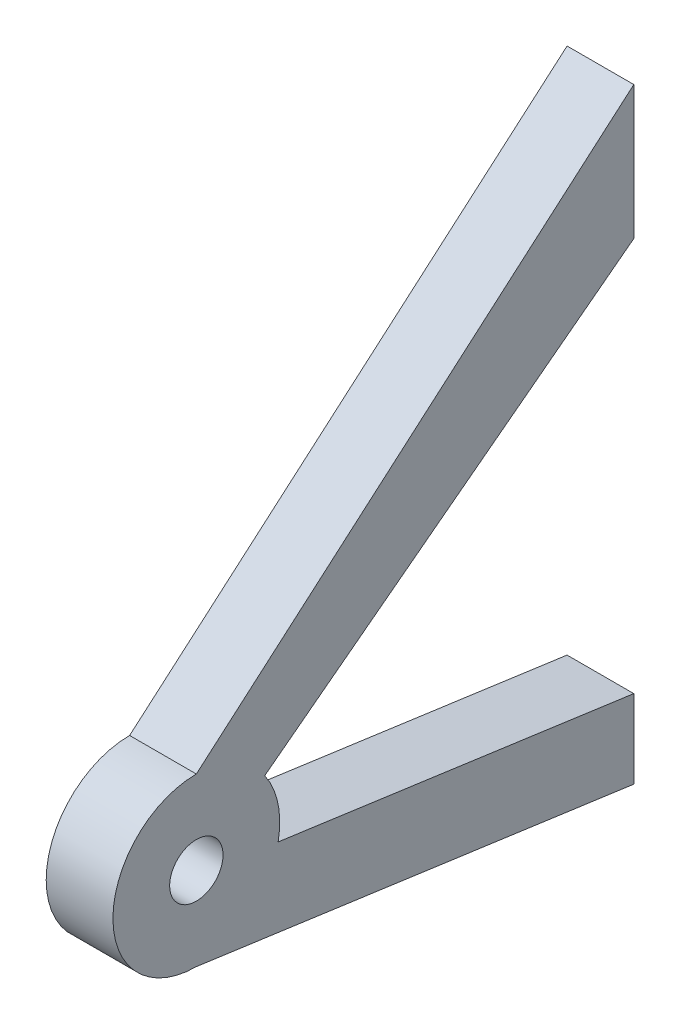
ISO-10303-21;
HEADER;
FILE_DESCRIPTION(('STEP AP214'),'2;1');
FILE_NAME('part.step','',(''),(''),'','','');
FILE_SCHEMA(('AUTOMOTIVE_DESIGN { 1 0 10303 214 1 1 1 1 }'));
ENDSEC;
DATA;
#1=APPLICATION_CONTEXT('core data for automotive mechanical design processes');
#2=APPLICATION_PROTOCOL_DEFINITION('international standard','automotive_design',2000,#1);
#3=PRODUCT_CONTEXT('',#1,'mechanical');
#4=PRODUCT('Part','Part','',(#3));
#5=PRODUCT_RELATED_PRODUCT_CATEGORY('part','',(#4));
#6=PRODUCT_DEFINITION_FORMATION('','',#4);
#7=PRODUCT_DEFINITION_CONTEXT('part definition',#1,'design');
#8=PRODUCT_DEFINITION('design','',#6,#7);
#9=PRODUCT_DEFINITION_SHAPE('','',#8);
#10=(LENGTH_UNIT() NAMED_UNIT(*) SI_UNIT(.MILLI.,.METRE.));
#11=(NAMED_UNIT(*) PLANE_ANGLE_UNIT() SI_UNIT($,.RADIAN.));
#12=(NAMED_UNIT(*) SI_UNIT($,.STERADIAN.) SOLID_ANGLE_UNIT());
#13=UNCERTAINTY_MEASURE_WITH_UNIT(LENGTH_MEASURE(1.E-05),#10,'distance_accuracy_value','');
#14=(GEOMETRIC_REPRESENTATION_CONTEXT(3) GLOBAL_UNCERTAINTY_ASSIGNED_CONTEXT((#13)) GLOBAL_UNIT_ASSIGNED_CONTEXT((#10,
#11,#12)) REPRESENTATION_CONTEXT('',''));
#15=CARTESIAN_POINT('',(0.,0.,0.));
#16=DIRECTION('',(0.,0.,1.));
#17=DIRECTION('',(1.,0.,0.));
#18=AXIS2_PLACEMENT_3D('',#15,#16,#17);
#19=CARTESIAN_POINT('',(-27.9271684967378,17.419112642267,164.013892996037));
#20=DIRECTION('',(1.,0.,0.));
#21=DIRECTION('',(0.,1.,0.));
#22=AXIS2_PLACEMENT_3D('',#19,#20,#21);
#23=CYLINDRICAL_SURFACE('',#22,7.93750000000001);
#24=CARTESIAN_POINT('',(-21.5771684967378,17.419112642267,164.013892996037));
#25=DIRECTION('',(1.,0.,0.));
#26=DIRECTION('',(0.,1.,0.));
#27=AXIS2_PLACEMENT_3D('',#24,#25,#26);
#28=CIRCLE('',#27,7.93750000000001);
#29=CARTESIAN_POINT('',(-21.5771684967378,21.9653877787596,157.507335639545));
#30=VERTEX_POINT('',#29);
#31=CARTESIAN_POINT('',(-21.5771684967378,15.8677740511462,156.22946913645));
#32=VERTEX_POINT('',#31);
#33=EDGE_CURVE('E137',#30,#32,#28,.F.);
#34=ORIENTED_EDGE('',*,*,#33,.T.);
#35=DIRECTION('',(1.,0.,0.));
#36=VECTOR('',#35,1.);
#37=CARTESIAN_POINT('',(-27.9271684967378,15.8677740511462,156.22946913645));
#38=LINE('',#37,#36);
#39=CARTESIAN_POINT('',(-27.9271684967378,15.8677740511462,156.22946913645));
#40=VERTEX_POINT('',#39);
#41=EDGE_CURVE('E11',#40,#32,#38,.T.);
#42=ORIENTED_EDGE('',*,*,#41,.F.);
#43=CARTESIAN_POINT('',(-27.9271684967378,17.419112642267,164.013892996037));
#44=DIRECTION('',(1.,0.,0.));
#45=DIRECTION('',(0.,1.,0.));
#46=AXIS2_PLACEMENT_3D('',#43,#44,#45);
#47=CIRCLE('',#46,7.93750000000001);
#48=CARTESIAN_POINT('',(-27.9271684967378,21.9653877787596,157.507335639545));
#49=VERTEX_POINT('',#48);
#50=EDGE_CURVE('E154',#49,#40,#47,.F.);
#51=ORIENTED_EDGE('',*,*,#50,.F.);
#52=DIRECTION('',(1.,0.,0.));
#53=VECTOR('',#52,1.);
#54=CARTESIAN_POINT('',(-27.9271684967378,21.9653877787596,157.507335639545));
#55=LINE('',#54,#53);
#56=EDGE_CURVE('E39',#49,#30,#55,.T.);
#57=ORIENTED_EDGE('',*,*,#56,.T.);
#58=EDGE_LOOP('',(#34,#42,#51,#57));
#59=FACE_BOUND('',#58,.T.);
#60=ADVANCED_FACE('F36',(#59),#23,.T.);
#61=CARTESIAN_POINT('',(-27.9271684967378,-5.70980536664582,0.792629204329803));
#62=DIRECTION('',(0.,-0.990501709789782,0.137500410557634));
#63=DIRECTION('',(0.,-0.137500410557634,-0.990501709789782));
#64=AXIS2_PLACEMENT_3D('',#61,#62,#63);
#65=PLANE('',#64);
#66=DIRECTION('',(0.,-0.137500410557634,-0.990501709789782));
#67=VECTOR('',#66,1.);
#68=CARTESIAN_POINT('',(-21.5771684967378,-5.70980536664582,0.792629204329803));
#69=LINE('',#68,#67);
#70=CARTESIAN_POINT('',(-21.5771684967378,11.169831477006,122.387241805575));
#71=VERTEX_POINT('',#70);
#72=EDGE_CURVE('E79',#32,#71,#69,.T.);
#73=ORIENTED_EDGE('',*,*,#72,.T.);
#74=DIRECTION('',(1.,0.,0.));
#75=VECTOR('',#74,1.);
#76=CARTESIAN_POINT('',(-27.9271684967378,11.169831477006,122.387241805575));
#77=LINE('',#76,#75);
#78=CARTESIAN_POINT('',(-27.9271684967378,11.169831477006,122.387241805575));
#79=VERTEX_POINT('',#78);
#80=EDGE_CURVE('E45',#79,#71,#77,.T.);
#81=ORIENTED_EDGE('',*,*,#80,.F.);
#82=DIRECTION('',(0.,-0.137500410557634,-0.990501709789782));
#83=VECTOR('',#82,1.);
#84=CARTESIAN_POINT('',(-27.9271684967378,-5.70980536664582,0.792629204329803));
#85=LINE('',#84,#83);
#86=EDGE_CURVE('E53',#40,#79,#85,.T.);
#87=ORIENTED_EDGE('',*,*,#86,.F.);
#88=ORIENTED_EDGE('',*,*,#41,.T.);
#89=EDGE_LOOP('',(#73,#81,#87,#88));
#90=FACE_BOUND('',#89,.T.);
#91=ADVANCED_FACE('F190',(#90),#65,.F.);
#92=CARTESIAN_POINT('',(-27.9271684967378,0.,122.387241805575));
#93=DIRECTION('',(0.,0.,1.));
#94=DIRECTION('',(1.,0.,0.));
#95=AXIS2_PLACEMENT_3D('',#92,#93,#94);
#96=PLANE('',#95);
#97=DIRECTION('',(0.,-1.,0.));
#98=VECTOR('',#97,1.);
#99=CARTESIAN_POINT('',(-21.5771684967378,0.,122.387241805575));
#100=LINE('',#99,#98);
#101=CARTESIAN_POINT('',(-21.5771684967378,3.70304449618815,122.387241805575));
#102=VERTEX_POINT('',#101);
#103=EDGE_CURVE('E119',#71,#102,#100,.T.);
#104=ORIENTED_EDGE('',*,*,#103,.T.);
#105=DIRECTION('',(1.,0.,0.));
#106=VECTOR('',#105,1.);
#107=CARTESIAN_POINT('',(-27.9271684967378,3.70304449618815,122.387241805575));
#108=LINE('',#107,#106);
#109=CARTESIAN_POINT('',(-27.9271684967378,3.70304449618815,122.387241805575));
#110=VERTEX_POINT('',#109);
#111=EDGE_CURVE('E117',#110,#102,#108,.T.);
#112=ORIENTED_EDGE('',*,*,#111,.F.);
#113=DIRECTION('',(0.,-1.,0.));
#114=VECTOR('',#113,1.);
#115=CARTESIAN_POINT('',(-27.9271684967378,0.,122.387241805575));
#116=LINE('',#115,#114);
#117=EDGE_CURVE('E105',#79,#110,#116,.T.);
#118=ORIENTED_EDGE('',*,*,#117,.F.);
#119=ORIENTED_EDGE('',*,*,#80,.T.);
#120=EDGE_LOOP('',(#104,#112,#118,#119));
#121=FACE_BOUND('',#120,.T.);
#122=ADVANCED_FACE('F118',(#121),#96,.F.);
#123=CARTESIAN_POINT('',(-27.9271684967378,-13.0354225630811,1.80956371553998));
#124=DIRECTION('',(0.,0.990501709789782,-0.137500410557634));
#125=DIRECTION('',(0.,0.137500410557634,0.990501709789782));
#126=AXIS2_PLACEMENT_3D('',#123,#124,#125);
#127=PLANE('',#126);
#128=DIRECTION('',(0.,0.137500410557634,0.990501709789782));
#129=VECTOR('',#128,1.);
#130=CARTESIAN_POINT('',(-21.5771684967378,-13.0354225630811,1.80956371553998));
#131=LINE('',#130,#129);
#132=CARTESIAN_POINT('',(-21.5771684967378,9.481612642267,164.013892996037));
#133=VERTEX_POINT('',#132);
#134=EDGE_CURVE('E149',#102,#133,#131,.T.);
#135=ORIENTED_EDGE('',*,*,#134,.T.);
#136=DIRECTION('',(1.,0.,0.));
#137=VECTOR('',#136,1.);
#138=CARTESIAN_POINT('',(-27.9271684967378,9.481612642267,164.013892996037));
#139=LINE('',#138,#137);
#140=CARTESIAN_POINT('',(-27.9271684967378,9.481612642267,164.013892996037));
#141=VERTEX_POINT('',#140);
#142=EDGE_CURVE('E123',#141,#133,#139,.T.);
#143=ORIENTED_EDGE('',*,*,#142,.F.);
#144=DIRECTION('',(0.,0.137500410557634,0.990501709789782));
#145=VECTOR('',#144,1.);
#146=CARTESIAN_POINT('',(-27.9271684967378,-13.0354225630811,1.80956371553998));
#147=LINE('',#146,#145);
#148=EDGE_CURVE('E111',#110,#141,#147,.T.);
#149=ORIENTED_EDGE('',*,*,#148,.F.);
#150=ORIENTED_EDGE('',*,*,#111,.T.);
#151=EDGE_LOOP('',(#135,#143,#149,#150));
#152=FACE_BOUND('',#151,.T.);
#153=ADVANCED_FACE('F125',(#152),#127,.F.);
#154=CARTESIAN_POINT('',(-27.9271684967378,17.419112642267,164.013892996037));
#155=DIRECTION('',(1.,0.,0.));
#156=DIRECTION('',(0.,1.,0.));
#157=AXIS2_PLACEMENT_3D('',#154,#155,#156);
#158=CYLINDRICAL_SURFACE('',#157,7.93750000000001);
#159=CARTESIAN_POINT('',(-21.5771684967378,17.419112642267,164.013892996037));
#160=DIRECTION('',(1.,0.,0.));
#161=DIRECTION('',(0.,1.,0.));
#162=AXIS2_PLACEMENT_3D('',#159,#160,#161);
#163=CIRCLE('',#162,7.93750000000001);
#164=CARTESIAN_POINT('',(-21.5771684967378,25.356612642267,164.013892996037));
#165=VERTEX_POINT('',#164);
#166=EDGE_CURVE('E146',#165,#133,#163,.T.);
#167=ORIENTED_EDGE('',*,*,#166,.F.);
#168=DIRECTION('',(1.,0.,0.));
#169=VECTOR('',#168,1.);
#170=CARTESIAN_POINT('',(-27.9271684967378,25.356612642267,164.013892996037));
#171=LINE('',#170,#169);
#172=CARTESIAN_POINT('',(-27.9271684967378,25.356612642267,164.013892996037));
#173=VERTEX_POINT('',#172);
#174=EDGE_CURVE('E158',#173,#165,#171,.T.);
#175=ORIENTED_EDGE('',*,*,#174,.F.);
#176=CARTESIAN_POINT('',(-27.9271684967378,17.419112642267,164.013892996037));
#177=DIRECTION('',(1.,0.,0.));
#178=DIRECTION('',(0.,1.,0.));
#179=AXIS2_PLACEMENT_3D('',#176,#177,#178);
#180=CIRCLE('',#179,7.93750000000001);
#181=EDGE_CURVE('E127',#173,#141,#180,.T.);
#182=ORIENTED_EDGE('',*,*,#181,.T.);
#183=ORIENTED_EDGE('',*,*,#142,.T.);
#184=EDGE_LOOP('',(#167,#175,#182,#183));
#185=FACE_BOUND('',#184,.T.);
#186=ADVANCED_FACE('F202',(#185),#158,.T.);
#187=CARTESIAN_POINT('',(-27.9271684967378,95.6562801945494,82.7380942013077));
#188=DIRECTION('',(0.,-0.756330551233301,-0.65418964931519));
#189=DIRECTION('',(0.,0.65418964931519,-0.756330551233301));
#190=AXIS2_PLACEMENT_3D('',#187,#188,#189);
#191=PLANE('',#190);
#192=DIRECTION('',(0.,0.65418964931519,-0.756330551233301));
#193=VECTOR('',#192,1.);
#194=CARTESIAN_POINT('',(-21.5771684967378,95.6562801945494,82.7380942013077));
#195=LINE('',#194,#193);
#196=CARTESIAN_POINT('',(-21.5771684967378,61.3616692938177,122.387241805575));
#197=VERTEX_POINT('',#196);
#198=EDGE_CURVE('E144',#165,#197,#195,.T.);
#199=ORIENTED_EDGE('',*,*,#198,.T.);
#200=DIRECTION('',(1.,0.,0.));
#201=VECTOR('',#200,1.);
#202=CARTESIAN_POINT('',(-27.9271684967378,61.3616692938177,122.387241805575));
#203=LINE('',#202,#201);
#204=CARTESIAN_POINT('',(-27.9271684967378,61.3616692938177,122.387241805575));
#205=VERTEX_POINT('',#204);
#206=EDGE_CURVE('E160',#205,#197,#203,.T.);
#207=ORIENTED_EDGE('',*,*,#206,.F.);
#208=DIRECTION('',(0.,0.65418964931519,-0.756330551233301));
#209=VECTOR('',#208,1.);
#210=CARTESIAN_POINT('',(-27.9271684967378,95.6562801945494,82.7380942013077));
#211=LINE('',#210,#209);
#212=EDGE_CURVE('E129',#173,#205,#211,.T.);
#213=ORIENTED_EDGE('',*,*,#212,.F.);
#214=ORIENTED_EDGE('',*,*,#174,.T.);
#215=EDGE_LOOP('',(#199,#207,#213,#214));
#216=FACE_BOUND('',#215,.T.);
#217=ADVANCED_FACE('F185',(#216),#191,.F.);
#218=CARTESIAN_POINT('',(-21.5771684967378,48.6684623708307,122.387241805575));
#219=VERTEX_POINT('',#218);
#220=EDGE_CURVE('E142',#197,#219,#100,.T.);
#221=ORIENTED_EDGE('',*,*,#220,.T.);
#222=DIRECTION('',(1.,0.,0.));
#223=VECTOR('',#222,1.);
#224=CARTESIAN_POINT('',(-27.9271684967378,48.6684623708307,122.387241805575));
#225=LINE('',#224,#223);
#226=CARTESIAN_POINT('',(-27.9271684967378,48.6684623708307,122.387241805575));
#227=VERTEX_POINT('',#226);
#228=EDGE_CURVE('E162',#227,#219,#225,.T.);
#229=ORIENTED_EDGE('',*,*,#228,.F.);
#230=EDGE_CURVE('E115',#205,#227,#116,.T.);
#231=ORIENTED_EDGE('',*,*,#230,.F.);
#232=ORIENTED_EDGE('',*,*,#206,.T.);
#233=EDGE_LOOP('',(#221,#229,#231,#232));
#234=FACE_BOUND('',#233,.T.);
#235=ADVANCED_FACE('F178',(#234),#96,.F.);
#236=CARTESIAN_POINT('',(-27.9271684967378,89.8060415786455,68.2827739137086));
#237=DIRECTION('',(0.,0.79603329327978,0.605252836416442));
#238=DIRECTION('',(0.,-0.605252836416442,0.79603329327978));
#239=AXIS2_PLACEMENT_3D('',#236,#237,#238);
#240=PLANE('',#239);
#241=DIRECTION('',(0.,-0.605252836416442,0.79603329327978));
#242=VECTOR('',#241,1.);
#243=CARTESIAN_POINT('',(-21.5771684967378,89.8060415786455,68.2827739137086));
#244=LINE('',#243,#242);
#245=EDGE_CURVE('E140',#219,#30,#244,.T.);
#246=ORIENTED_EDGE('',*,*,#245,.T.);
#247=ORIENTED_EDGE('',*,*,#56,.F.);
#248=DIRECTION('',(0.,-0.605252836416442,0.79603329327978));
#249=VECTOR('',#248,1.);
#250=CARTESIAN_POINT('',(-27.9271684967378,89.8060415786455,68.2827739137086));
#251=LINE('',#250,#249);
#252=EDGE_CURVE('E91',#227,#49,#251,.T.);
#253=ORIENTED_EDGE('',*,*,#252,.F.);
#254=ORIENTED_EDGE('',*,*,#228,.T.);
#255=EDGE_LOOP('',(#246,#247,#253,#254));
#256=FACE_BOUND('',#255,.T.);
#257=ADVANCED_FACE('F175',(#256),#240,.F.);
#258=CARTESIAN_POINT('',(-27.9271684967378,17.419112642267,164.013892996037));
#259=DIRECTION('',(1.,0.,0.));
#260=DIRECTION('',(0.,1.,0.));
#261=AXIS2_PLACEMENT_3D('',#258,#259,#260);
#262=CYLINDRICAL_SURFACE('',#261,2.54000000000001);
#263=CARTESIAN_POINT('',(-27.9271684967378,17.419112642267,164.013892996037));
#264=DIRECTION('',(1.,0.,0.));
#265=DIRECTION('',(0.,1.,0.));
#266=AXIS2_PLACEMENT_3D('',#263,#264,#265);
#267=CIRCLE('',#266,2.54000000000001);
#268=CARTESIAN_POINT('',(-27.9271684967378,19.959112642267,164.013892996037));
#269=VERTEX_POINT('',#268);
#270=EDGE_CURVE('E134',#269,#269,#267,.T.);
#271=ORIENTED_EDGE('',*,*,#270,.F.);
#272=EDGE_LOOP('',(#271));
#273=FACE_BOUND('',#272,.T.);
#274=CARTESIAN_POINT('',(-21.5771684967378,17.419112642267,164.013892996037));
#275=DIRECTION('',(1.,0.,0.));
#276=DIRECTION('',(0.,1.,0.));
#277=AXIS2_PLACEMENT_3D('',#274,#275,#276);
#278=CIRCLE('',#277,2.54000000000001);
#279=CARTESIAN_POINT('',(-21.5771684967378,19.959112642267,164.013892996037));
#280=VERTEX_POINT('',#279);
#281=EDGE_CURVE('E152',#280,#280,#278,.T.);
#282=ORIENTED_EDGE('',*,*,#281,.T.);
#283=EDGE_LOOP('',(#282));
#284=FACE_BOUND('',#283,.T.);
#285=ADVANCED_FACE('F177',(#273,#284),#262,.F.);
#286=CARTESIAN_POINT('',(-27.9271684967378,0.,0.));
#287=DIRECTION('',(1.,0.,0.));
#288=DIRECTION('',(0.,1.,0.));
#289=AXIS2_PLACEMENT_3D('',#286,#287,#288);
#290=PLANE('',#289);
#291=ORIENTED_EDGE('',*,*,#50,.T.);
#292=ORIENTED_EDGE('',*,*,#86,.T.);
#293=ORIENTED_EDGE('',*,*,#117,.T.);
#294=ORIENTED_EDGE('',*,*,#148,.T.);
#295=ORIENTED_EDGE('',*,*,#181,.F.);
#296=ORIENTED_EDGE('',*,*,#212,.T.);
#297=ORIENTED_EDGE('',*,*,#230,.T.);
#298=ORIENTED_EDGE('',*,*,#252,.T.);
#299=EDGE_LOOP('',(#291,#292,#293,#294,#295,#296,#297,#298));
#300=FACE_BOUND('',#299,.T.);
#301=ORIENTED_EDGE('',*,*,#270,.T.);
#302=EDGE_LOOP('',(#301));
#303=FACE_BOUND('',#302,.T.);
#304=ADVANCED_FACE('F107',(#300,#303),#290,.F.);
#305=CARTESIAN_POINT('',(-21.5771684967378,0.,0.));
#306=DIRECTION('',(1.,0.,0.));
#307=DIRECTION('',(0.,1.,0.));
#308=AXIS2_PLACEMENT_3D('',#305,#306,#307);
#309=PLANE('',#308);
#310=ORIENTED_EDGE('',*,*,#33,.F.);
#311=ORIENTED_EDGE('',*,*,#245,.F.);
#312=ORIENTED_EDGE('',*,*,#220,.F.);
#313=ORIENTED_EDGE('',*,*,#198,.F.);
#314=ORIENTED_EDGE('',*,*,#166,.T.);
#315=ORIENTED_EDGE('',*,*,#134,.F.);
#316=ORIENTED_EDGE('',*,*,#103,.F.);
#317=ORIENTED_EDGE('',*,*,#72,.F.);
#318=EDGE_LOOP('',(#310,#311,#312,#313,#314,#315,#316,#317));
#319=FACE_BOUND('',#318,.T.);
#320=ORIENTED_EDGE('',*,*,#281,.F.);
#321=EDGE_LOOP('',(#320));
#322=FACE_BOUND('',#321,.T.);
#323=ADVANCED_FACE('F171',(#319,#322),#309,.T.);
#324=CLOSED_SHELL('',(#60,#91,#122,#153,#186,#217,#235,#257,#285,#304,#323));
#325=MANIFOLD_SOLID_BREP('B2',#324);
#326=ADVANCED_BREP_SHAPE_REPRESENTATION('',(#18,#325),#14);
#327=SHAPE_DEFINITION_REPRESENTATION(#9,#326);
ENDSEC;
END-ISO-10303-21;
